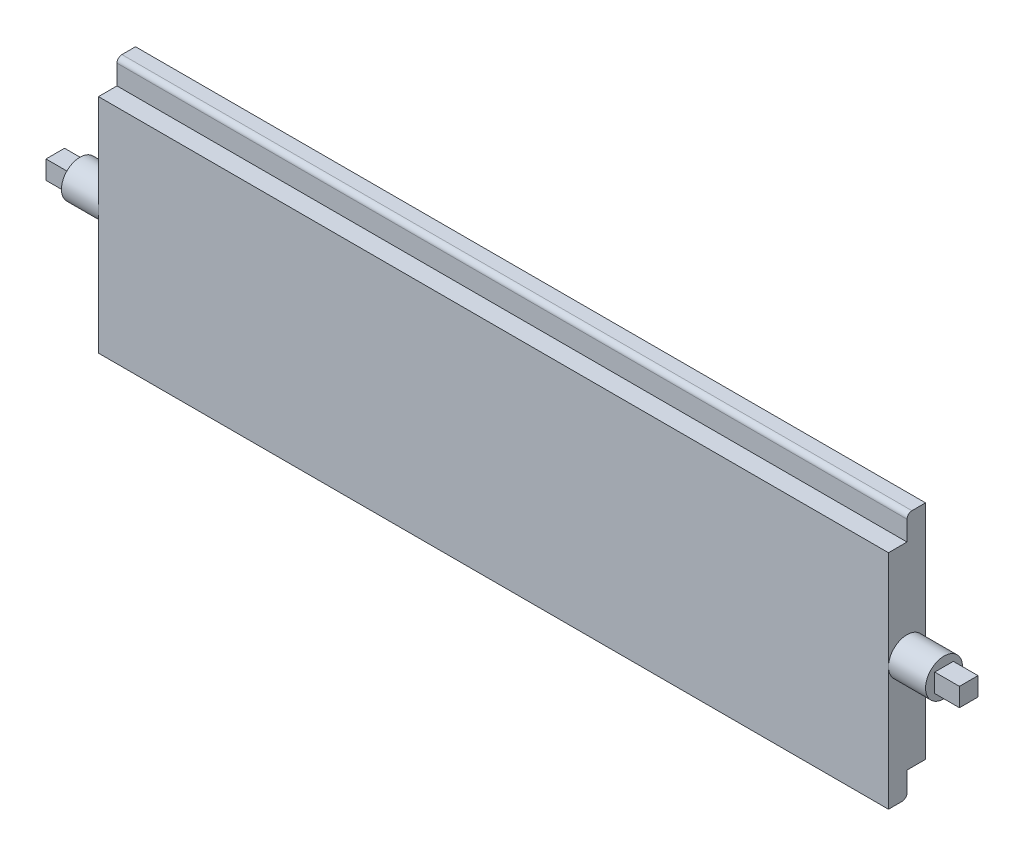
ISO-10303-21;
HEADER;
FILE_DESCRIPTION(('STEP AP214'),'2;1');
FILE_NAME('part.step','',(''),(''),'','','');
FILE_SCHEMA(('AUTOMOTIVE_DESIGN { 1 0 10303 214 1 1 1 1 }'));
ENDSEC;
DATA;
#1=APPLICATION_CONTEXT('core data for automotive mechanical design processes');
#2=APPLICATION_PROTOCOL_DEFINITION('international standard','automotive_design',2000,#1);
#3=PRODUCT_CONTEXT('',#1,'mechanical');
#4=PRODUCT('Part','Part','',(#3));
#5=PRODUCT_RELATED_PRODUCT_CATEGORY('part','',(#4));
#6=PRODUCT_DEFINITION_FORMATION('','',#4);
#7=PRODUCT_DEFINITION_CONTEXT('part definition',#1,'design');
#8=PRODUCT_DEFINITION('design','',#6,#7);
#9=PRODUCT_DEFINITION_SHAPE('','',#8);
#10=(LENGTH_UNIT() NAMED_UNIT(*) SI_UNIT(.MILLI.,.METRE.));
#11=(NAMED_UNIT(*) PLANE_ANGLE_UNIT() SI_UNIT($,.RADIAN.));
#12=(NAMED_UNIT(*) SI_UNIT($,.STERADIAN.) SOLID_ANGLE_UNIT());
#13=UNCERTAINTY_MEASURE_WITH_UNIT(LENGTH_MEASURE(1.E-05),#10,'distance_accuracy_value','');
#14=(GEOMETRIC_REPRESENTATION_CONTEXT(3) GLOBAL_UNCERTAINTY_ASSIGNED_CONTEXT((#13)) GLOBAL_UNIT_ASSIGNED_CONTEXT((#10,
#11,#12)) REPRESENTATION_CONTEXT('',''));
#15=CARTESIAN_POINT('',(0.,0.,0.));
#16=DIRECTION('',(0.,0.,1.));
#17=DIRECTION('',(1.,0.,0.));
#18=AXIS2_PLACEMENT_3D('',#15,#16,#17);
#19=CARTESIAN_POINT('',(-101.6,31.75,4.7625));
#20=DIRECTION('',(0.,-1.,0.));
#21=DIRECTION('',(0.,0.,-1.));
#22=AXIS2_PLACEMENT_3D('',#19,#20,#21);
#23=PLANE('',#22);
#24=DIRECTION('',(0.,0.,-1.));
#25=VECTOR('',#24,1.);
#26=CARTESIAN_POINT('',(-101.6,31.75,4.7625));
#27=LINE('',#26,#25);
#28=CARTESIAN_POINT('',(-101.6,31.75,-1.27));
#29=VERTEX_POINT('',#28);
#30=CARTESIAN_POINT('',(-101.6,31.75,-4.7625));
#31=VERTEX_POINT('',#30);
#32=EDGE_CURVE('E369',#29,#31,#27,.T.);
#33=ORIENTED_EDGE('',*,*,#32,.F.);
#34=DIRECTION('',(-1.,0.,0.));
#35=VECTOR('',#34,1.);
#36=CARTESIAN_POINT('',(101.6,31.75,-1.27));
#37=LINE('',#36,#35);
#38=CARTESIAN_POINT('',(101.6,31.75,-1.27));
#39=VERTEX_POINT('',#38);
#40=EDGE_CURVE('E48',#29,#39,#37,.F.);
#41=ORIENTED_EDGE('',*,*,#40,.T.);
#42=DIRECTION('',(0.,0.,-1.));
#43=VECTOR('',#42,1.);
#44=CARTESIAN_POINT('',(101.6,31.75,4.7625));
#45=LINE('',#44,#43);
#46=CARTESIAN_POINT('',(101.6,31.75,-4.7625));
#47=VERTEX_POINT('',#46);
#48=EDGE_CURVE('E372',#39,#47,#45,.T.);
#49=ORIENTED_EDGE('',*,*,#48,.T.);
#50=DIRECTION('',(-1.,0.,0.));
#51=VECTOR('',#50,1.);
#52=CARTESIAN_POINT('',(-101.6,31.75,-4.7625));
#53=LINE('',#52,#51);
#54=EDGE_CURVE('E354',#47,#31,#53,.T.);
#55=ORIENTED_EDGE('',*,*,#54,.T.);
#56=EDGE_LOOP('',(#33,#41,#49,#55));
#57=FACE_BOUND('',#56,.T.);
#58=ADVANCED_FACE('F39',(#57),#23,.F.);
#59=CARTESIAN_POINT('',(-111.125,0.,0.));
#60=DIRECTION('',(-1.,0.,0.));
#61=DIRECTION('',(0.,0.,-1.));
#62=AXIS2_PLACEMENT_3D('',#59,#60,#61);
#63=PLANE('',#62);
#64=CARTESIAN_POINT('',(-111.125,0.,0.));
#65=DIRECTION('',(1.,0.,0.));
#66=DIRECTION('',(0.,0.,-1.));
#67=AXIS2_PLACEMENT_3D('',#64,#65,#66);
#68=CIRCLE('',#67,4.76249999999911);
#69=CARTESIAN_POINT('',(-111.125,0.,-4.76249999999911));
#70=VERTEX_POINT('',#69);
#71=EDGE_CURVE('E275',#70,#70,#68,.T.);
#72=ORIENTED_EDGE('',*,*,#71,.F.);
#73=EDGE_LOOP('',(#72));
#74=FACE_BOUND('',#73,.T.);
#75=DIRECTION('',(0.,0.,-1.));
#76=VECTOR('',#75,1.);
#77=CARTESIAN_POINT('',(-111.125,-2.3876,2.3876));
#78=LINE('',#77,#76);
#79=CARTESIAN_POINT('',(-111.125,-2.3876,2.3876));
#80=VERTEX_POINT('',#79);
#81=CARTESIAN_POINT('',(-111.125,-2.3876,-2.3876));
#82=VERTEX_POINT('',#81);
#83=EDGE_CURVE('E251',#80,#82,#78,.T.);
#84=ORIENTED_EDGE('',*,*,#83,.T.);
#85=DIRECTION('',(0.,1.,0.));
#86=VECTOR('',#85,1.);
#87=CARTESIAN_POINT('',(-111.125,-2.3876,-2.3876));
#88=LINE('',#87,#86);
#89=CARTESIAN_POINT('',(-111.125,2.3876,-2.3876));
#90=VERTEX_POINT('',#89);
#91=EDGE_CURVE('E227',#82,#90,#88,.T.);
#92=ORIENTED_EDGE('',*,*,#91,.T.);
#93=DIRECTION('',(0.,0.,1.));
#94=VECTOR('',#93,1.);
#95=CARTESIAN_POINT('',(-111.125,2.3876,2.3876));
#96=LINE('',#95,#94);
#97=CARTESIAN_POINT('',(-111.125,2.3876,2.3876));
#98=VERTEX_POINT('',#97);
#99=EDGE_CURVE('E235',#90,#98,#96,.T.);
#100=ORIENTED_EDGE('',*,*,#99,.T.);
#101=DIRECTION('',(0.,-1.,0.));
#102=VECTOR('',#101,1.);
#103=CARTESIAN_POINT('',(-111.125,-2.3876,2.3876));
#104=LINE('',#103,#102);
#105=EDGE_CURVE('E255',#98,#80,#104,.T.);
#106=ORIENTED_EDGE('',*,*,#105,.T.);
#107=EDGE_LOOP('',(#84,#92,#100,#106));
#108=FACE_BOUND('',#107,.T.);
#109=ADVANCED_FACE('F457',(#74,#108),#63,.T.);
#110=CARTESIAN_POINT('',(-101.6,-31.75,4.7625));
#111=DIRECTION('',(1.,0.,0.));
#112=DIRECTION('',(0.,0.,-1.));
#113=AXIS2_PLACEMENT_3D('',#110,#111,#112);
#114=PLANE('',#113);
#115=DIRECTION('',(0.,-1.,0.));
#116=VECTOR('',#115,1.);
#117=CARTESIAN_POINT('',(-101.6,31.75,0.));
#118=LINE('',#117,#116);
#119=CARTESIAN_POINT('',(-101.6,30.48,0.));
#120=VERTEX_POINT('',#119);
#121=CARTESIAN_POINT('',(-101.6,25.4,0.));
#122=VERTEX_POINT('',#121);
#123=EDGE_CURVE('E209',#120,#122,#118,.T.);
#124=ORIENTED_EDGE('',*,*,#123,.F.);
#125=CARTESIAN_POINT('',(-101.6,30.48,-1.27));
#126=DIRECTION('',(1.,0.,0.));
#127=DIRECTION('',(0.,0.,-1.));
#128=AXIS2_PLACEMENT_3D('',#125,#126,#127);
#129=CIRCLE('',#128,1.27);
#130=EDGE_CURVE('E62',#120,#29,#129,.F.);
#131=ORIENTED_EDGE('',*,*,#130,.T.);
#132=ORIENTED_EDGE('',*,*,#32,.T.);
#133=DIRECTION('',(0.,-1.,0.));
#134=VECTOR('',#133,1.);
#135=CARTESIAN_POINT('',(-101.6,-31.75,-4.7625));
#136=LINE('',#135,#134);
#137=CARTESIAN_POINT('',(-101.6,0.,-4.7625));
#138=VERTEX_POINT('',#137);
#139=EDGE_CURVE('E358',#31,#138,#136,.T.);
#140=ORIENTED_EDGE('',*,*,#139,.T.);
#141=CARTESIAN_POINT('',(-101.6,0.,0.));
#142=DIRECTION('',(1.,0.,0.));
#143=DIRECTION('',(0.,0.,-1.));
#144=AXIS2_PLACEMENT_3D('',#141,#142,#143);
#145=CIRCLE('',#144,4.76249999999911);
#146=CARTESIAN_POINT('',(-101.6,0.,4.76249999999911));
#147=VERTEX_POINT('',#146);
#148=EDGE_CURVE('E274',#138,#147,#145,.T.);
#149=ORIENTED_EDGE('',*,*,#148,.T.);
#150=DIRECTION('',(0.,-1.,0.));
#151=VECTOR('',#150,1.);
#152=CARTESIAN_POINT('',(-101.6,-31.75,4.7625));
#153=LINE('',#152,#151);
#154=CARTESIAN_POINT('',(-101.6,25.4,4.7625));
#155=VERTEX_POINT('',#154);
#156=EDGE_CURVE('E344',#155,#147,#153,.T.);
#157=ORIENTED_EDGE('',*,*,#156,.F.);
#158=DIRECTION('',(0.,0.,1.));
#159=VECTOR('',#158,1.);
#160=CARTESIAN_POINT('',(-101.6,25.4,0.));
#161=LINE('',#160,#159);
#162=EDGE_CURVE('E220',#122,#155,#161,.T.);
#163=ORIENTED_EDGE('',*,*,#162,.F.);
#164=EDGE_LOOP('',(#124,#131,#132,#140,#149,#157,#163));
#165=FACE_BOUND('',#164,.T.);
#166=ADVANCED_FACE('F423',(#165),#114,.F.);
#167=CARTESIAN_POINT('',(101.6,-31.75,4.7625));
#168=DIRECTION('',(-1.,0.,0.));
#169=DIRECTION('',(0.,0.,1.));
#170=AXIS2_PLACEMENT_3D('',#167,#168,#169);
#171=PLANE('',#170);
#172=ORIENTED_EDGE('',*,*,#48,.F.);
#173=CARTESIAN_POINT('',(101.6,30.48,-1.27));
#174=DIRECTION('',(-1.,0.,0.));
#175=DIRECTION('',(0.,0.,1.));
#176=AXIS2_PLACEMENT_3D('',#173,#174,#175);
#177=CIRCLE('',#176,1.27);
#178=CARTESIAN_POINT('',(101.6,30.48,0.));
#179=VERTEX_POINT('',#178);
#180=EDGE_CURVE('E11',#39,#179,#177,.F.);
#181=ORIENTED_EDGE('',*,*,#180,.T.);
#182=DIRECTION('',(0.,1.,0.));
#183=VECTOR('',#182,1.);
#184=CARTESIAN_POINT('',(101.6,31.75,0.));
#185=LINE('',#184,#183);
#186=CARTESIAN_POINT('',(101.6,25.4,0.));
#187=VERTEX_POINT('',#186);
#188=EDGE_CURVE('E216',#187,#179,#185,.T.);
#189=ORIENTED_EDGE('',*,*,#188,.F.);
#190=DIRECTION('',(0.,0.,1.));
#191=VECTOR('',#190,1.);
#192=CARTESIAN_POINT('',(101.6,25.4,0.));
#193=LINE('',#192,#191);
#194=CARTESIAN_POINT('',(101.6,25.4,4.7625));
#195=VERTEX_POINT('',#194);
#196=EDGE_CURVE('E223',#187,#195,#193,.T.);
#197=ORIENTED_EDGE('',*,*,#196,.T.);
#198=DIRECTION('',(0.,1.,0.));
#199=VECTOR('',#198,1.);
#200=CARTESIAN_POINT('',(101.6,-31.75,4.7625));
#201=LINE('',#200,#199);
#202=CARTESIAN_POINT('',(101.6,0.,4.7625));
#203=VERTEX_POINT('',#202);
#204=EDGE_CURVE('E343',#203,#195,#201,.T.);
#205=ORIENTED_EDGE('',*,*,#204,.F.);
#206=CARTESIAN_POINT('',(101.6,0.,0.));
#207=DIRECTION('',(1.,0.,0.));
#208=DIRECTION('',(0.,0.,-1.));
#209=AXIS2_PLACEMENT_3D('',#206,#207,#208);
#210=CIRCLE('',#209,4.76249999999911);
#211=CARTESIAN_POINT('',(101.6,0.,-4.76249999999911));
#212=VERTEX_POINT('',#211);
#213=EDGE_CURVE('E328',#212,#203,#210,.T.);
#214=ORIENTED_EDGE('',*,*,#213,.F.);
#215=DIRECTION('',(0.,1.,0.));
#216=VECTOR('',#215,1.);
#217=CARTESIAN_POINT('',(101.6,-31.75,-4.7625));
#218=LINE('',#217,#216);
#219=EDGE_CURVE('E333',#212,#47,#218,.T.);
#220=ORIENTED_EDGE('',*,*,#219,.T.);
#221=EDGE_LOOP('',(#172,#181,#189,#197,#205,#214,#220));
#222=FACE_BOUND('',#221,.T.);
#223=ADVANCED_FACE('F405',(#222),#171,.F.);
#224=DIRECTION('',(0.,0.,-1.));
#225=VECTOR('',#224,1.);
#226=CARTESIAN_POINT('',(101.6,-31.75,4.7625));
#227=LINE('',#226,#225);
#228=CARTESIAN_POINT('',(101.6,-31.75,4.7625));
#229=VERTEX_POINT('',#228);
#230=CARTESIAN_POINT('',(101.6,-31.75,1.27));
#231=VERTEX_POINT('',#230);
#232=EDGE_CURVE('E350',#229,#231,#227,.T.);
#233=ORIENTED_EDGE('',*,*,#232,.T.);
#234=CARTESIAN_POINT('',(101.6,-30.48,1.27));
#235=DIRECTION('',(-1.,0.,0.));
#236=DIRECTION('',(0.,0.,1.));
#237=AXIS2_PLACEMENT_3D('',#234,#235,#236);
#238=CIRCLE('',#237,1.27);
#239=CARTESIAN_POINT('',(101.6,-30.48,0.));
#240=VERTEX_POINT('',#239);
#241=EDGE_CURVE('E383',#231,#240,#238,.F.);
#242=ORIENTED_EDGE('',*,*,#241,.T.);
#243=DIRECTION('',(0.,-1.,0.));
#244=VECTOR('',#243,1.);
#245=CARTESIAN_POINT('',(101.6,-31.75,0.));
#246=LINE('',#245,#244);
#247=CARTESIAN_POINT('',(101.6,-25.4,0.));
#248=VERTEX_POINT('',#247);
#249=EDGE_CURVE('E187',#248,#240,#246,.T.);
#250=ORIENTED_EDGE('',*,*,#249,.F.);
#251=DIRECTION('',(0.,0.,-1.));
#252=VECTOR('',#251,1.);
#253=CARTESIAN_POINT('',(101.6,-25.4,0.));
#254=LINE('',#253,#252);
#255=CARTESIAN_POINT('',(101.6,-25.4,-4.7625));
#256=VERTEX_POINT('',#255);
#257=EDGE_CURVE('E194',#248,#256,#254,.T.);
#258=ORIENTED_EDGE('',*,*,#257,.T.);
#259=EDGE_CURVE('E351',#256,#212,#218,.T.);
#260=ORIENTED_EDGE('',*,*,#259,.T.);
#261=EDGE_CURVE('E337',#203,#212,#210,.T.);
#262=ORIENTED_EDGE('',*,*,#261,.F.);
#263=EDGE_CURVE('E338',#229,#203,#201,.T.);
#264=ORIENTED_EDGE('',*,*,#263,.F.);
#265=EDGE_LOOP('',(#233,#242,#250,#258,#260,#262,#264));
#266=FACE_BOUND('',#265,.T.);
#267=ADVANCED_FACE('F447',(#266),#171,.F.);
#268=DIRECTION('',(0.,1.,0.));
#269=VECTOR('',#268,1.);
#270=CARTESIAN_POINT('',(-101.6,-31.75,0.));
#271=LINE('',#270,#269);
#272=CARTESIAN_POINT('',(-101.6,-30.48,0.));
#273=VERTEX_POINT('',#272);
#274=CARTESIAN_POINT('',(-101.6,-25.4,0.));
#275=VERTEX_POINT('',#274);
#276=EDGE_CURVE('E176',#273,#275,#271,.T.);
#277=ORIENTED_EDGE('',*,*,#276,.F.);
#278=CARTESIAN_POINT('',(-101.6,-30.48,1.27));
#279=DIRECTION('',(1.,0.,0.));
#280=DIRECTION('',(0.,0.,-1.));
#281=AXIS2_PLACEMENT_3D('',#278,#279,#280);
#282=CIRCLE('',#281,1.27);
#283=CARTESIAN_POINT('',(-101.6,-31.75,1.27));
#284=VERTEX_POINT('',#283);
#285=EDGE_CURVE('E377',#273,#284,#282,.F.);
#286=ORIENTED_EDGE('',*,*,#285,.T.);
#287=DIRECTION('',(0.,0.,-1.));
#288=VECTOR('',#287,1.);
#289=CARTESIAN_POINT('',(-101.6,-31.75,4.7625));
#290=LINE('',#289,#288);
#291=CARTESIAN_POINT('',(-101.6,-31.75,4.7625));
#292=VERTEX_POINT('',#291);
#293=EDGE_CURVE('E365',#292,#284,#290,.T.);
#294=ORIENTED_EDGE('',*,*,#293,.F.);
#295=EDGE_CURVE('E342',#147,#292,#153,.T.);
#296=ORIENTED_EDGE('',*,*,#295,.F.);
#297=EDGE_CURVE('E283',#147,#138,#145,.T.);
#298=ORIENTED_EDGE('',*,*,#297,.T.);
#299=CARTESIAN_POINT('',(-101.6,-25.4,-4.7625));
#300=VERTEX_POINT('',#299);
#301=EDGE_CURVE('E201',#138,#300,#136,.T.);
#302=ORIENTED_EDGE('',*,*,#301,.T.);
#303=DIRECTION('',(0.,0.,-1.));
#304=VECTOR('',#303,1.);
#305=CARTESIAN_POINT('',(-101.6,-25.4,0.));
#306=LINE('',#305,#304);
#307=EDGE_CURVE('E191',#275,#300,#306,.T.);
#308=ORIENTED_EDGE('',*,*,#307,.F.);
#309=EDGE_LOOP('',(#277,#286,#294,#296,#298,#302,#308));
#310=FACE_BOUND('',#309,.T.);
#311=ADVANCED_FACE('F198',(#310),#114,.F.);
#312=CARTESIAN_POINT('',(-101.6,-31.75,4.7625));
#313=DIRECTION('',(0.,1.,0.));
#314=DIRECTION('',(0.,0.,1.));
#315=AXIS2_PLACEMENT_3D('',#312,#313,#314);
#316=PLANE('',#315);
#317=ORIENTED_EDGE('',*,*,#293,.T.);
#318=DIRECTION('',(-1.,0.,0.));
#319=VECTOR('',#318,1.);
#320=CARTESIAN_POINT('',(-101.6,-31.75,1.27));
#321=LINE('',#320,#319);
#322=EDGE_CURVE('E380',#284,#231,#321,.F.);
#323=ORIENTED_EDGE('',*,*,#322,.T.);
#324=ORIENTED_EDGE('',*,*,#232,.F.);
#325=DIRECTION('',(1.,0.,0.));
#326=VECTOR('',#325,1.);
#327=CARTESIAN_POINT('',(-101.6,-31.75,4.7625));
#328=LINE('',#327,#326);
#329=EDGE_CURVE('E347',#292,#229,#328,.T.);
#330=ORIENTED_EDGE('',*,*,#329,.F.);
#331=EDGE_LOOP('',(#317,#323,#324,#330));
#332=FACE_BOUND('',#331,.T.);
#333=ADVANCED_FACE('F442',(#332),#316,.F.);
#334=CARTESIAN_POINT('',(0.,0.,4.7625));
#335=DIRECTION('',(0.,0.,-1.));
#336=DIRECTION('',(-1.,0.,0.));
#337=AXIS2_PLACEMENT_3D('',#334,#335,#336);
#338=PLANE('',#337);
#339=ORIENTED_EDGE('',*,*,#204,.T.);
#340=DIRECTION('',(1.,0.,0.));
#341=VECTOR('',#340,1.);
#342=CARTESIAN_POINT('',(-101.6,25.4,4.7625));
#343=LINE('',#342,#341);
#344=EDGE_CURVE('E205',#155,#195,#343,.T.);
#345=ORIENTED_EDGE('',*,*,#344,.F.);
#346=ORIENTED_EDGE('',*,*,#156,.T.);
#347=ORIENTED_EDGE('',*,*,#295,.T.);
#348=ORIENTED_EDGE('',*,*,#329,.T.);
#349=ORIENTED_EDGE('',*,*,#263,.T.);
#350=EDGE_LOOP('',(#339,#345,#346,#347,#348,#349));
#351=FACE_BOUND('',#350,.T.);
#352=ADVANCED_FACE('F427',(#351),#338,.F.);
#353=CARTESIAN_POINT('',(0.,0.,-4.7625));
#354=DIRECTION('',(0.,0.,-1.));
#355=DIRECTION('',(-1.,0.,0.));
#356=AXIS2_PLACEMENT_3D('',#353,#354,#355);
#357=PLANE('',#356);
#358=DIRECTION('',(1.,0.,0.));
#359=VECTOR('',#358,1.);
#360=CARTESIAN_POINT('',(101.6,-25.4,-4.7625));
#361=LINE('',#360,#359);
#362=EDGE_CURVE('E431',#300,#256,#361,.T.);
#363=ORIENTED_EDGE('',*,*,#362,.F.);
#364=ORIENTED_EDGE('',*,*,#301,.F.);
#365=ORIENTED_EDGE('',*,*,#139,.F.);
#366=ORIENTED_EDGE('',*,*,#54,.F.);
#367=ORIENTED_EDGE('',*,*,#219,.F.);
#368=ORIENTED_EDGE('',*,*,#259,.F.);
#369=EDGE_LOOP('',(#363,#364,#365,#366,#367,#368));
#370=FACE_BOUND('',#369,.T.);
#371=ADVANCED_FACE('F411',(#370),#357,.T.);
#372=CARTESIAN_POINT('',(111.125,0.,0.));
#373=DIRECTION('',(-1.,0.,0.));
#374=DIRECTION('',(0.,0.,1.));
#375=AXIS2_PLACEMENT_3D('',#372,#373,#374);
#376=CYLINDRICAL_SURFACE('',#375,4.76249999999911);
#377=CARTESIAN_POINT('',(111.125,0.,0.));
#378=DIRECTION('',(1.,0.,0.));
#379=DIRECTION('',(0.,0.,-1.));
#380=AXIS2_PLACEMENT_3D('',#377,#378,#379);
#381=CIRCLE('',#380,4.76249999999911);
#382=CARTESIAN_POINT('',(111.125,0.,-4.76249999999911));
#383=VERTEX_POINT('',#382);
#384=EDGE_CURVE('E329',#383,#383,#381,.T.);
#385=ORIENTED_EDGE('',*,*,#384,.F.);
#386=EDGE_LOOP('',(#385));
#387=FACE_BOUND('',#386,.T.);
#388=ORIENTED_EDGE('',*,*,#213,.T.);
#389=ORIENTED_EDGE('',*,*,#261,.T.);
#390=EDGE_LOOP('',(#388,#389));
#391=FACE_BOUND('',#390,.T.);
#392=ADVANCED_FACE('F446',(#387,#391),#376,.T.);
#393=CARTESIAN_POINT('',(111.125,0.,0.));
#394=DIRECTION('',(1.,0.,0.));
#395=DIRECTION('',(0.,0.,-1.));
#396=AXIS2_PLACEMENT_3D('',#393,#394,#395);
#397=PLANE('',#396);
#398=DIRECTION('',(0.,1.,0.));
#399=VECTOR('',#398,1.);
#400=CARTESIAN_POINT('',(111.125,-2.3876,-2.3876));
#401=LINE('',#400,#399);
#402=CARTESIAN_POINT('',(111.125,-2.3876,-2.3876));
#403=VERTEX_POINT('',#402);
#404=CARTESIAN_POINT('',(111.125,2.3876,-2.3876));
#405=VERTEX_POINT('',#404);
#406=EDGE_CURVE('E279',#403,#405,#401,.T.);
#407=ORIENTED_EDGE('',*,*,#406,.F.);
#408=DIRECTION('',(0.,0.,-1.));
#409=VECTOR('',#408,1.);
#410=CARTESIAN_POINT('',(111.125,-2.3876,2.3876));
#411=LINE('',#410,#409);
#412=CARTESIAN_POINT('',(111.125,-2.3876,2.3876));
#413=VERTEX_POINT('',#412);
#414=EDGE_CURVE('E289',#413,#403,#411,.T.);
#415=ORIENTED_EDGE('',*,*,#414,.F.);
#416=DIRECTION('',(0.,-1.,0.));
#417=VECTOR('',#416,1.);
#418=CARTESIAN_POINT('',(111.125,-2.3876,2.3876));
#419=LINE('',#418,#417);
#420=CARTESIAN_POINT('',(111.125,2.3876,2.3876));
#421=VERTEX_POINT('',#420);
#422=EDGE_CURVE('E306',#421,#413,#419,.T.);
#423=ORIENTED_EDGE('',*,*,#422,.F.);
#424=DIRECTION('',(0.,0.,1.));
#425=VECTOR('',#424,1.);
#426=CARTESIAN_POINT('',(111.125,2.3876,2.3876));
#427=LINE('',#426,#425);
#428=EDGE_CURVE('E302',#405,#421,#427,.T.);
#429=ORIENTED_EDGE('',*,*,#428,.F.);
#430=EDGE_LOOP('',(#407,#415,#423,#429));
#431=FACE_BOUND('',#430,.T.);
#432=ORIENTED_EDGE('',*,*,#384,.T.);
#433=EDGE_LOOP('',(#432));
#434=FACE_BOUND('',#433,.T.);
#435=ADVANCED_FACE('F472',(#431,#434),#397,.T.);
#436=CARTESIAN_POINT('',(117.475,-2.3876,-2.3876));
#437=DIRECTION('',(0.,0.,1.));
#438=DIRECTION('',(1.,0.,0.));
#439=AXIS2_PLACEMENT_3D('',#436,#437,#438);
#440=PLANE('',#439);
#441=ORIENTED_EDGE('',*,*,#406,.T.);
#442=DIRECTION('',(-1.,0.,0.));
#443=VECTOR('',#442,1.);
#444=CARTESIAN_POINT('',(117.475,2.3876,-2.3876));
#445=LINE('',#444,#443);
#446=CARTESIAN_POINT('',(117.475,2.3876,-2.3876));
#447=VERTEX_POINT('',#446);
#448=EDGE_CURVE('E324',#447,#405,#445,.T.);
#449=ORIENTED_EDGE('',*,*,#448,.F.);
#450=DIRECTION('',(0.,1.,0.));
#451=VECTOR('',#450,1.);
#452=CARTESIAN_POINT('',(117.475,-2.3876,-2.3876));
#453=LINE('',#452,#451);
#454=CARTESIAN_POINT('',(117.475,-2.3876,-2.3876));
#455=VERTEX_POINT('',#454);
#456=EDGE_CURVE('E284',#455,#447,#453,.T.);
#457=ORIENTED_EDGE('',*,*,#456,.F.);
#458=DIRECTION('',(-1.,0.,0.));
#459=VECTOR('',#458,1.);
#460=CARTESIAN_POINT('',(117.475,-2.3876,-2.3876));
#461=LINE('',#460,#459);
#462=EDGE_CURVE('E298',#455,#403,#461,.T.);
#463=ORIENTED_EDGE('',*,*,#462,.T.);
#464=EDGE_LOOP('',(#441,#449,#457,#463));
#465=FACE_BOUND('',#464,.T.);
#466=ADVANCED_FACE('F476',(#465),#440,.F.);
#467=CARTESIAN_POINT('',(117.475,2.3876,2.3876));
#468=DIRECTION('',(0.,-1.,0.));
#469=DIRECTION('',(0.,0.,-1.));
#470=AXIS2_PLACEMENT_3D('',#467,#468,#469);
#471=PLANE('',#470);
#472=ORIENTED_EDGE('',*,*,#428,.T.);
#473=DIRECTION('',(-1.,0.,0.));
#474=VECTOR('',#473,1.);
#475=CARTESIAN_POINT('',(117.475,2.3876,2.3876));
#476=LINE('',#475,#474);
#477=CARTESIAN_POINT('',(117.475,2.3876,2.3876));
#478=VERTEX_POINT('',#477);
#479=EDGE_CURVE('E320',#478,#421,#476,.T.);
#480=ORIENTED_EDGE('',*,*,#479,.F.);
#481=DIRECTION('',(0.,0.,1.));
#482=VECTOR('',#481,1.);
#483=CARTESIAN_POINT('',(117.475,2.3876,2.3876));
#484=LINE('',#483,#482);
#485=EDGE_CURVE('E288',#447,#478,#484,.T.);
#486=ORIENTED_EDGE('',*,*,#485,.F.);
#487=ORIENTED_EDGE('',*,*,#448,.T.);
#488=EDGE_LOOP('',(#472,#480,#486,#487));
#489=FACE_BOUND('',#488,.T.);
#490=ADVANCED_FACE('F480',(#489),#471,.F.);
#491=CARTESIAN_POINT('',(117.475,-2.3876,2.3876));
#492=DIRECTION('',(0.,0.,-1.));
#493=DIRECTION('',(-1.,0.,0.));
#494=AXIS2_PLACEMENT_3D('',#491,#492,#493);
#495=PLANE('',#494);
#496=ORIENTED_EDGE('',*,*,#422,.T.);
#497=DIRECTION('',(-1.,0.,0.));
#498=VECTOR('',#497,1.);
#499=CARTESIAN_POINT('',(117.475,-2.3876,2.3876));
#500=LINE('',#499,#498);
#501=CARTESIAN_POINT('',(117.475,-2.3876,2.3876));
#502=VERTEX_POINT('',#501);
#503=EDGE_CURVE('E316',#502,#413,#500,.T.);
#504=ORIENTED_EDGE('',*,*,#503,.F.);
#505=DIRECTION('',(0.,-1.,0.));
#506=VECTOR('',#505,1.);
#507=CARTESIAN_POINT('',(117.475,-2.3876,2.3876));
#508=LINE('',#507,#506);
#509=EDGE_CURVE('E292',#478,#502,#508,.T.);
#510=ORIENTED_EDGE('',*,*,#509,.F.);
#511=ORIENTED_EDGE('',*,*,#479,.T.);
#512=EDGE_LOOP('',(#496,#504,#510,#511));
#513=FACE_BOUND('',#512,.T.);
#514=ADVANCED_FACE('F484',(#513),#495,.F.);
#515=CARTESIAN_POINT('',(117.475,-2.3876,2.3876));
#516=DIRECTION('',(0.,1.,0.));
#517=DIRECTION('',(0.,0.,1.));
#518=AXIS2_PLACEMENT_3D('',#515,#516,#517);
#519=PLANE('',#518);
#520=ORIENTED_EDGE('',*,*,#414,.T.);
#521=ORIENTED_EDGE('',*,*,#462,.F.);
#522=DIRECTION('',(0.,0.,-1.));
#523=VECTOR('',#522,1.);
#524=CARTESIAN_POINT('',(117.475,-2.3876,2.3876));
#525=LINE('',#524,#523);
#526=EDGE_CURVE('E295',#502,#455,#525,.T.);
#527=ORIENTED_EDGE('',*,*,#526,.F.);
#528=ORIENTED_EDGE('',*,*,#503,.T.);
#529=EDGE_LOOP('',(#520,#521,#527,#528));
#530=FACE_BOUND('',#529,.T.);
#531=ADVANCED_FACE('F488',(#530),#519,.F.);
#532=CARTESIAN_POINT('',(117.475,0.,0.));
#533=DIRECTION('',(-1.,0.,0.));
#534=DIRECTION('',(0.,0.,1.));
#535=AXIS2_PLACEMENT_3D('',#532,#533,#534);
#536=PLANE('',#535);
#537=ORIENTED_EDGE('',*,*,#456,.T.);
#538=ORIENTED_EDGE('',*,*,#485,.T.);
#539=ORIENTED_EDGE('',*,*,#509,.T.);
#540=ORIENTED_EDGE('',*,*,#526,.T.);
#541=EDGE_LOOP('',(#537,#538,#539,#540));
#542=FACE_BOUND('',#541,.T.);
#543=ADVANCED_FACE('F492',(#542),#536,.F.);
#544=CARTESIAN_POINT('',(-111.125,0.,0.));
#545=DIRECTION('',(1.,0.,0.));
#546=DIRECTION('',(0.,0.,-1.));
#547=AXIS2_PLACEMENT_3D('',#544,#545,#546);
#548=CYLINDRICAL_SURFACE('',#547,4.76249999999911);
#549=ORIENTED_EDGE('',*,*,#71,.T.);
#550=EDGE_LOOP('',(#549));
#551=FACE_BOUND('',#550,.T.);
#552=ORIENTED_EDGE('',*,*,#148,.F.);
#553=ORIENTED_EDGE('',*,*,#297,.F.);
#554=EDGE_LOOP('',(#552,#553));
#555=FACE_BOUND('',#554,.T.);
#556=ADVANCED_FACE('F430',(#551,#555),#548,.T.);
#557=CARTESIAN_POINT('',(-117.475,-2.3876,-2.3876));
#558=DIRECTION('',(0.,0.,-1.));
#559=DIRECTION('',(-1.,0.,0.));
#560=AXIS2_PLACEMENT_3D('',#557,#558,#559);
#561=PLANE('',#560);
#562=ORIENTED_EDGE('',*,*,#91,.F.);
#563=DIRECTION('',(1.,0.,0.));
#564=VECTOR('',#563,1.);
#565=CARTESIAN_POINT('',(-117.475,-2.3876,-2.3876));
#566=LINE('',#565,#564);
#567=CARTESIAN_POINT('',(-117.475,-2.3876,-2.3876));
#568=VERTEX_POINT('',#567);
#569=EDGE_CURVE('E270',#568,#82,#566,.T.);
#570=ORIENTED_EDGE('',*,*,#569,.F.);
#571=DIRECTION('',(0.,1.,0.));
#572=VECTOR('',#571,1.);
#573=CARTESIAN_POINT('',(-117.475,-2.3876,-2.3876));
#574=LINE('',#573,#572);
#575=CARTESIAN_POINT('',(-117.475,2.3876,-2.3876));
#576=VERTEX_POINT('',#575);
#577=EDGE_CURVE('E230',#568,#576,#574,.T.);
#578=ORIENTED_EDGE('',*,*,#577,.T.);
#579=DIRECTION('',(1.,0.,0.));
#580=VECTOR('',#579,1.);
#581=CARTESIAN_POINT('',(-117.475,2.3876,-2.3876));
#582=LINE('',#581,#580);
#583=EDGE_CURVE('E247',#576,#90,#582,.T.);
#584=ORIENTED_EDGE('',*,*,#583,.T.);
#585=EDGE_LOOP('',(#562,#570,#578,#584));
#586=FACE_BOUND('',#585,.T.);
#587=ADVANCED_FACE('F498',(#586),#561,.T.);
#588=CARTESIAN_POINT('',(-117.475,-2.3876,2.3876));
#589=DIRECTION('',(0.,-1.,0.));
#590=DIRECTION('',(0.,0.,-1.));
#591=AXIS2_PLACEMENT_3D('',#588,#589,#590);
#592=PLANE('',#591);
#593=ORIENTED_EDGE('',*,*,#83,.F.);
#594=DIRECTION('',(1.,0.,0.));
#595=VECTOR('',#594,1.);
#596=CARTESIAN_POINT('',(-117.475,-2.3876,2.3876));
#597=LINE('',#596,#595);
#598=CARTESIAN_POINT('',(-117.475,-2.3876,2.3876));
#599=VERTEX_POINT('',#598);
#600=EDGE_CURVE('E267',#599,#80,#597,.T.);
#601=ORIENTED_EDGE('',*,*,#600,.F.);
#602=DIRECTION('',(0.,0.,-1.));
#603=VECTOR('',#602,1.);
#604=CARTESIAN_POINT('',(-117.475,-2.3876,2.3876));
#605=LINE('',#604,#603);
#606=EDGE_CURVE('E234',#599,#568,#605,.T.);
#607=ORIENTED_EDGE('',*,*,#606,.T.);
#608=ORIENTED_EDGE('',*,*,#569,.T.);
#609=EDGE_LOOP('',(#593,#601,#607,#608));
#610=FACE_BOUND('',#609,.T.);
#611=ADVANCED_FACE('F503',(#610),#592,.T.);
#612=CARTESIAN_POINT('',(-117.475,-2.3876,2.3876));
#613=DIRECTION('',(0.,0.,1.));
#614=DIRECTION('',(1.,0.,0.));
#615=AXIS2_PLACEMENT_3D('',#612,#613,#614);
#616=PLANE('',#615);
#617=ORIENTED_EDGE('',*,*,#105,.F.);
#618=DIRECTION('',(1.,0.,0.));
#619=VECTOR('',#618,1.);
#620=CARTESIAN_POINT('',(-117.475,2.3876,2.3876));
#621=LINE('',#620,#619);
#622=CARTESIAN_POINT('',(-117.475,2.3876,2.3876));
#623=VERTEX_POINT('',#622);
#624=EDGE_CURVE('E264',#623,#98,#621,.T.);
#625=ORIENTED_EDGE('',*,*,#624,.F.);
#626=DIRECTION('',(0.,-1.,0.));
#627=VECTOR('',#626,1.);
#628=CARTESIAN_POINT('',(-117.475,-2.3876,2.3876));
#629=LINE('',#628,#627);
#630=EDGE_CURVE('E239',#623,#599,#629,.T.);
#631=ORIENTED_EDGE('',*,*,#630,.T.);
#632=ORIENTED_EDGE('',*,*,#600,.T.);
#633=EDGE_LOOP('',(#617,#625,#631,#632));
#634=FACE_BOUND('',#633,.T.);
#635=ADVANCED_FACE('F507',(#634),#616,.T.);
#636=CARTESIAN_POINT('',(-117.475,2.3876,2.3876));
#637=DIRECTION('',(0.,1.,0.));
#638=DIRECTION('',(0.,0.,1.));
#639=AXIS2_PLACEMENT_3D('',#636,#637,#638);
#640=PLANE('',#639);
#641=ORIENTED_EDGE('',*,*,#99,.F.);
#642=ORIENTED_EDGE('',*,*,#583,.F.);
#643=DIRECTION('',(0.,0.,1.));
#644=VECTOR('',#643,1.);
#645=CARTESIAN_POINT('',(-117.475,2.3876,2.3876));
#646=LINE('',#645,#644);
#647=EDGE_CURVE('E243',#576,#623,#646,.T.);
#648=ORIENTED_EDGE('',*,*,#647,.T.);
#649=ORIENTED_EDGE('',*,*,#624,.T.);
#650=EDGE_LOOP('',(#641,#642,#648,#649));
#651=FACE_BOUND('',#650,.T.);
#652=ADVANCED_FACE('F511',(#651),#640,.T.);
#653=CARTESIAN_POINT('',(-117.475,0.,0.));
#654=DIRECTION('',(1.,0.,0.));
#655=DIRECTION('',(0.,0.,1.));
#656=AXIS2_PLACEMENT_3D('',#653,#654,#655);
#657=PLANE('',#656);
#658=ORIENTED_EDGE('',*,*,#577,.F.);
#659=ORIENTED_EDGE('',*,*,#606,.F.);
#660=ORIENTED_EDGE('',*,*,#630,.F.);
#661=ORIENTED_EDGE('',*,*,#647,.F.);
#662=EDGE_LOOP('',(#658,#659,#660,#661));
#663=FACE_BOUND('',#662,.T.);
#664=ADVANCED_FACE('F515',(#663),#657,.F.);
#665=CARTESIAN_POINT('',(-101.6,25.4,0.));
#666=DIRECTION('',(0.,-1.,0.));
#667=DIRECTION('',(0.,0.,-1.));
#668=AXIS2_PLACEMENT_3D('',#665,#666,#667);
#669=PLANE('',#668);
#670=ORIENTED_EDGE('',*,*,#344,.T.);
#671=ORIENTED_EDGE('',*,*,#196,.F.);
#672=DIRECTION('',(1.,0.,0.));
#673=VECTOR('',#672,1.);
#674=CARTESIAN_POINT('',(-101.6,25.4,0.));
#675=LINE('',#674,#673);
#676=EDGE_CURVE('E212',#122,#187,#675,.T.);
#677=ORIENTED_EDGE('',*,*,#676,.F.);
#678=ORIENTED_EDGE('',*,*,#162,.T.);
#679=EDGE_LOOP('',(#670,#671,#677,#678));
#680=FACE_BOUND('',#679,.T.);
#681=ADVANCED_FACE('F420',(#680),#669,.F.);
#682=CARTESIAN_POINT('',(0.,0.,0.));
#683=DIRECTION('',(0.,0.,1.));
#684=DIRECTION('',(1.,0.,0.));
#685=AXIS2_PLACEMENT_3D('',#682,#683,#684);
#686=PLANE('',#685);
#687=ORIENTED_EDGE('',*,*,#188,.T.);
#688=DIRECTION('',(-1.,0.,0.));
#689=VECTOR('',#688,1.);
#690=CARTESIAN_POINT('',(-101.6,30.48,0.));
#691=LINE('',#690,#689);
#692=EDGE_CURVE('E386',#179,#120,#691,.T.);
#693=ORIENTED_EDGE('',*,*,#692,.T.);
#694=ORIENTED_EDGE('',*,*,#123,.T.);
#695=ORIENTED_EDGE('',*,*,#676,.T.);
#696=EDGE_LOOP('',(#687,#693,#694,#695));
#697=FACE_BOUND('',#696,.T.);
#698=ADVANCED_FACE('F416',(#697),#686,.T.);
#699=CARTESIAN_POINT('',(101.6,-25.4,0.));
#700=DIRECTION('',(0.,1.,0.));
#701=DIRECTION('',(0.,0.,1.));
#702=AXIS2_PLACEMENT_3D('',#699,#700,#701);
#703=PLANE('',#702);
#704=ORIENTED_EDGE('',*,*,#362,.T.);
#705=ORIENTED_EDGE('',*,*,#257,.F.);
#706=DIRECTION('',(1.,0.,0.));
#707=VECTOR('',#706,1.);
#708=CARTESIAN_POINT('',(101.6,-25.4,0.));
#709=LINE('',#708,#707);
#710=EDGE_CURVE('E180',#275,#248,#709,.T.);
#711=ORIENTED_EDGE('',*,*,#710,.F.);
#712=ORIENTED_EDGE('',*,*,#307,.T.);
#713=EDGE_LOOP('',(#704,#705,#711,#712));
#714=FACE_BOUND('',#713,.T.);
#715=ADVANCED_FACE('F190',(#714),#703,.F.);
#716=CARTESIAN_POINT('',(0.,0.,0.));
#717=DIRECTION('',(0.,0.,1.));
#718=DIRECTION('',(1.,0.,0.));
#719=AXIS2_PLACEMENT_3D('',#716,#717,#718);
#720=PLANE('',#719);
#721=ORIENTED_EDGE('',*,*,#249,.T.);
#722=DIRECTION('',(-1.,0.,0.));
#723=VECTOR('',#722,1.);
#724=CARTESIAN_POINT('',(0.,-30.48,0.));
#725=LINE('',#724,#723);
#726=EDGE_CURVE('E183',#240,#273,#725,.T.);
#727=ORIENTED_EDGE('',*,*,#726,.T.);
#728=ORIENTED_EDGE('',*,*,#276,.T.);
#729=ORIENTED_EDGE('',*,*,#710,.T.);
#730=EDGE_LOOP('',(#721,#727,#728,#729));
#731=FACE_BOUND('',#730,.T.);
#732=ADVANCED_FACE('F179',(#731),#720,.F.);
#733=CARTESIAN_POINT('',(0.,-30.48,1.27));
#734=DIRECTION('',(-1.,0.,0.));
#735=DIRECTION('',(0.,0.,1.));
#736=AXIS2_PLACEMENT_3D('',#733,#734,#735);
#737=CYLINDRICAL_SURFACE('',#736,1.27);
#738=ORIENTED_EDGE('',*,*,#241,.F.);
#739=ORIENTED_EDGE('',*,*,#322,.F.);
#740=ORIENTED_EDGE('',*,*,#285,.F.);
#741=ORIENTED_EDGE('',*,*,#726,.F.);
#742=EDGE_LOOP('',(#738,#739,#740,#741));
#743=FACE_BOUND('',#742,.T.);
#744=ADVANCED_FACE('F438',(#743),#737,.T.);
#745=CARTESIAN_POINT('',(0.,30.48,-1.27));
#746=DIRECTION('',(1.,0.,0.));
#747=DIRECTION('',(0.,0.,-1.));
#748=AXIS2_PLACEMENT_3D('',#745,#746,#747);
#749=CYLINDRICAL_SURFACE('',#748,1.27);
#750=ORIENTED_EDGE('',*,*,#180,.F.);
#751=ORIENTED_EDGE('',*,*,#40,.F.);
#752=ORIENTED_EDGE('',*,*,#130,.F.);
#753=ORIENTED_EDGE('',*,*,#692,.F.);
#754=EDGE_LOOP('',(#750,#751,#752,#753));
#755=FACE_BOUND('',#754,.T.);
#756=ADVANCED_FACE('F41',(#755),#749,.T.);
#757=CLOSED_SHELL('',(#58,#109,#166,#223,#267,#311,#333,#352,#371,#392,#435,#466,#490,#514,#531,
#543,#556,#587,#611,#635,#652,#664,#681,#698,#715,#732,#744,#756));
#758=MANIFOLD_SOLID_BREP('B2',#757);
#759=ADVANCED_BREP_SHAPE_REPRESENTATION('',(#18,#758),#14);
#760=SHAPE_DEFINITION_REPRESENTATION(#9,#759);
ENDSEC;
END-ISO-10303-21;
